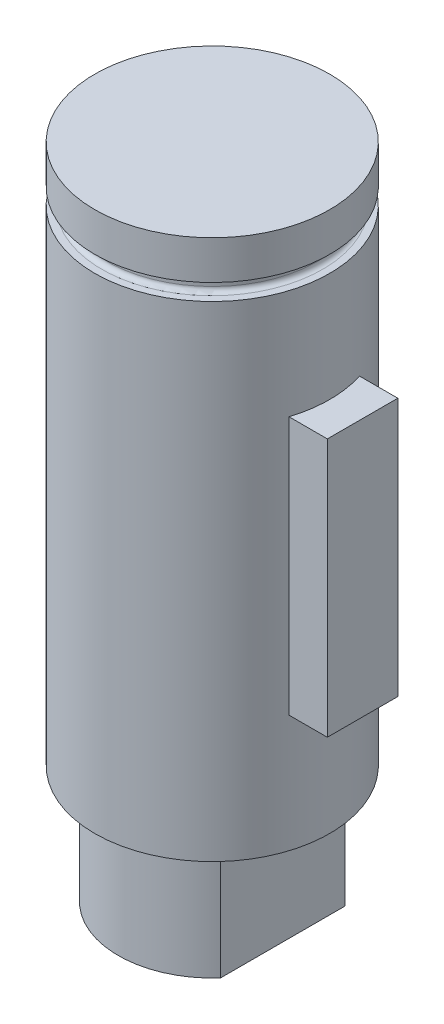
ISO-10303-21;
HEADER;
FILE_DESCRIPTION(('STEP AP214'),'2;1');
FILE_NAME('part.step','',(''),(''),'','','');
FILE_SCHEMA(('AUTOMOTIVE_DESIGN { 1 0 10303 214 1 1 1 1 }'));
ENDSEC;
DATA;
#1=APPLICATION_CONTEXT('core data for automotive mechanical design processes');
#2=APPLICATION_PROTOCOL_DEFINITION('international standard','automotive_design',2000,#1);
#3=PRODUCT_CONTEXT('',#1,'mechanical');
#4=PRODUCT('Part','Part','',(#3));
#5=PRODUCT_RELATED_PRODUCT_CATEGORY('part','',(#4));
#6=PRODUCT_DEFINITION_FORMATION('','',#4);
#7=PRODUCT_DEFINITION_CONTEXT('part definition',#1,'design');
#8=PRODUCT_DEFINITION('design','',#6,#7);
#9=PRODUCT_DEFINITION_SHAPE('','',#8);
#10=(LENGTH_UNIT() NAMED_UNIT(*) SI_UNIT(.MILLI.,.METRE.));
#11=(NAMED_UNIT(*) PLANE_ANGLE_UNIT() SI_UNIT($,.RADIAN.));
#12=(NAMED_UNIT(*) SI_UNIT($,.STERADIAN.) SOLID_ANGLE_UNIT());
#13=UNCERTAINTY_MEASURE_WITH_UNIT(LENGTH_MEASURE(1.E-05),#10,'distance_accuracy_value','');
#14=(GEOMETRIC_REPRESENTATION_CONTEXT(3) GLOBAL_UNCERTAINTY_ASSIGNED_CONTEXT((#13)) GLOBAL_UNIT_ASSIGNED_CONTEXT((#10,
#11,#12)) REPRESENTATION_CONTEXT('',''));
#15=CARTESIAN_POINT('',(0.,0.,0.));
#16=DIRECTION('',(0.,0.,1.));
#17=DIRECTION('',(1.,0.,0.));
#18=AXIS2_PLACEMENT_3D('',#15,#16,#17);
#19=CARTESIAN_POINT('',(0.,11.,0.));
#20=DIRECTION('',(0.,-1.,0.));
#21=DIRECTION('',(0.,0.,-1.));
#22=AXIS2_PLACEMENT_3D('',#19,#20,#21);
#23=CYLINDRICAL_SURFACE('',#22,5.);
#24=CARTESIAN_POINT('',(0.,-5.,0.));
#25=DIRECTION('',(0.,-1.,0.));
#26=DIRECTION('',(0.,0.,-1.));
#27=AXIS2_PLACEMENT_3D('',#24,#25,#26);
#28=CIRCLE('',#27,5.);
#29=CARTESIAN_POINT('',(0.,-5.,-5.));
#30=VERTEX_POINT('',#29);
#31=EDGE_CURVE('E139',#30,#30,#28,.T.);
#32=ORIENTED_EDGE('',*,*,#31,.F.);
#33=EDGE_LOOP('',(#32));
#34=FACE_BOUND('',#33,.T.);
#35=DIRECTION('',(0.,-1.,0.));
#36=VECTOR('',#35,1.);
#37=CARTESIAN_POINT('',(4.76969600708473,11.,-1.5));
#38=LINE('',#37,#36);
#39=CARTESIAN_POINT('',(4.76969600708473,11.,-1.5));
#40=VERTEX_POINT('',#39);
#41=CARTESIAN_POINT('',(4.76969600708473,0.,-1.5));
#42=VERTEX_POINT('',#41);
#43=EDGE_CURVE('E155',#40,#42,#38,.T.);
#44=ORIENTED_EDGE('',*,*,#43,.T.);
#45=CARTESIAN_POINT('',(0.,0.,0.));
#46=DIRECTION('',(0.,-1.,0.));
#47=DIRECTION('',(0.,0.,-1.));
#48=AXIS2_PLACEMENT_3D('',#45,#46,#47);
#49=CIRCLE('',#48,5.);
#50=CARTESIAN_POINT('',(4.76969600708473,0.,1.5));
#51=VERTEX_POINT('',#50);
#52=EDGE_CURVE('E138',#42,#51,#49,.T.);
#53=ORIENTED_EDGE('',*,*,#52,.T.);
#54=DIRECTION('',(0.,-1.,0.));
#55=VECTOR('',#54,1.);
#56=CARTESIAN_POINT('',(4.76969600708473,11.,1.5));
#57=LINE('',#56,#55);
#58=CARTESIAN_POINT('',(4.76969600708473,11.,1.5));
#59=VERTEX_POINT('',#58);
#60=EDGE_CURVE('E11',#59,#51,#57,.T.);
#61=ORIENTED_EDGE('',*,*,#60,.F.);
#62=CARTESIAN_POINT('',(0.,11.,0.));
#63=DIRECTION('',(0.,1.,0.));
#64=DIRECTION('',(0.,0.,1.));
#65=AXIS2_PLACEMENT_3D('',#62,#63,#64);
#66=CIRCLE('',#65,5.);
#67=EDGE_CURVE('E142',#59,#40,#66,.T.);
#68=ORIENTED_EDGE('',*,*,#67,.T.);
#69=EDGE_LOOP('',(#44,#53,#61,#68));
#70=FACE_BOUND('',#69,.T.);
#71=CARTESIAN_POINT('',(0.,15.65,0.));
#72=DIRECTION('',(0.,1.,0.));
#73=DIRECTION('',(0.,0.,1.));
#74=AXIS2_PLACEMENT_3D('',#71,#72,#73);
#75=CIRCLE('',#74,5.);
#76=CARTESIAN_POINT('',(0.,15.65,5.));
#77=VERTEX_POINT('',#76);
#78=EDGE_CURVE('E40',#77,#77,#75,.T.);
#79=ORIENTED_EDGE('',*,*,#78,.F.);
#80=EDGE_LOOP('',(#79));
#81=FACE_BOUND('',#80,.T.);
#82=ADVANCED_FACE('F37',(#34,#70,#81),#23,.T.);
#83=CARTESIAN_POINT('',(0.,0.,0.));
#84=DIRECTION('',(0.,1.,0.));
#85=DIRECTION('',(0.,0.,1.));
#86=AXIS2_PLACEMENT_3D('',#83,#84,#85);
#87=PLANE('',#86);
#88=ORIENTED_EDGE('',*,*,#52,.F.);
#89=DIRECTION('',(-1.,0.,0.));
#90=VECTOR('',#89,1.);
#91=CARTESIAN_POINT('',(6.4,0.,-1.5));
#92=LINE('',#91,#90);
#93=CARTESIAN_POINT('',(6.4,0.,-1.5));
#94=VERTEX_POINT('',#93);
#95=EDGE_CURVE('E152',#94,#42,#92,.T.);
#96=ORIENTED_EDGE('',*,*,#95,.F.);
#97=DIRECTION('',(0.,0.,-1.));
#98=VECTOR('',#97,1.);
#99=CARTESIAN_POINT('',(6.4,0.,1.5));
#100=LINE('',#99,#98);
#101=CARTESIAN_POINT('',(6.4,0.,1.5));
#102=VERTEX_POINT('',#101);
#103=EDGE_CURVE('E79',#102,#94,#100,.T.);
#104=ORIENTED_EDGE('',*,*,#103,.F.);
#105=DIRECTION('',(1.,0.,0.));
#106=VECTOR('',#105,1.);
#107=CARTESIAN_POINT('',(6.4,0.,1.5));
#108=LINE('',#107,#106);
#109=EDGE_CURVE('E147',#51,#102,#108,.T.);
#110=ORIENTED_EDGE('',*,*,#109,.F.);
#111=EDGE_LOOP('',(#88,#96,#104,#110));
#112=FACE_BOUND('',#111,.T.);
#113=ADVANCED_FACE('F173',(#112),#87,.F.);
#114=CARTESIAN_POINT('',(6.4,11.,1.5));
#115=DIRECTION('',(0.,0.,-1.));
#116=DIRECTION('',(-1.,0.,0.));
#117=AXIS2_PLACEMENT_3D('',#114,#115,#116);
#118=PLANE('',#117);
#119=ORIENTED_EDGE('',*,*,#109,.T.);
#120=DIRECTION('',(0.,-1.,0.));
#121=VECTOR('',#120,1.);
#122=CARTESIAN_POINT('',(6.4,11.,1.5));
#123=LINE('',#122,#121);
#124=CARTESIAN_POINT('',(6.4,11.,1.5));
#125=VERTEX_POINT('',#124);
#126=EDGE_CURVE('E45',#125,#102,#123,.T.);
#127=ORIENTED_EDGE('',*,*,#126,.F.);
#128=DIRECTION('',(1.,0.,0.));
#129=VECTOR('',#128,1.);
#130=CARTESIAN_POINT('',(6.4,11.,1.5));
#131=LINE('',#130,#129);
#132=EDGE_CURVE('E83',#59,#125,#131,.T.);
#133=ORIENTED_EDGE('',*,*,#132,.F.);
#134=ORIENTED_EDGE('',*,*,#60,.T.);
#135=EDGE_LOOP('',(#119,#127,#133,#134));
#136=FACE_BOUND('',#135,.T.);
#137=ADVANCED_FACE('F179',(#136),#118,.F.);
#138=CARTESIAN_POINT('',(6.4,11.,1.5));
#139=DIRECTION('',(-1.,0.,0.));
#140=DIRECTION('',(0.,0.,1.));
#141=AXIS2_PLACEMENT_3D('',#138,#139,#140);
#142=PLANE('',#141);
#143=ORIENTED_EDGE('',*,*,#103,.T.);
#144=DIRECTION('',(0.,-1.,0.));
#145=VECTOR('',#144,1.);
#146=CARTESIAN_POINT('',(6.4,11.,-1.5));
#147=LINE('',#146,#145);
#148=CARTESIAN_POINT('',(6.4,11.,-1.5));
#149=VERTEX_POINT('',#148);
#150=EDGE_CURVE('E162',#149,#94,#147,.T.);
#151=ORIENTED_EDGE('',*,*,#150,.F.);
#152=DIRECTION('',(0.,0.,-1.));
#153=VECTOR('',#152,1.);
#154=CARTESIAN_POINT('',(6.4,11.,1.5));
#155=LINE('',#154,#153);
#156=EDGE_CURVE('E151',#125,#149,#155,.T.);
#157=ORIENTED_EDGE('',*,*,#156,.F.);
#158=ORIENTED_EDGE('',*,*,#126,.T.);
#159=EDGE_LOOP('',(#143,#151,#157,#158));
#160=FACE_BOUND('',#159,.T.);
#161=ADVANCED_FACE('F213',(#160),#142,.F.);
#162=CARTESIAN_POINT('',(6.4,11.,-1.5));
#163=DIRECTION('',(0.,0.,1.));
#164=DIRECTION('',(1.,0.,0.));
#165=AXIS2_PLACEMENT_3D('',#162,#163,#164);
#166=PLANE('',#165);
#167=ORIENTED_EDGE('',*,*,#95,.T.);
#168=ORIENTED_EDGE('',*,*,#43,.F.);
#169=DIRECTION('',(-1.,0.,0.));
#170=VECTOR('',#169,1.);
#171=CARTESIAN_POINT('',(6.4,11.,-1.5));
#172=LINE('',#171,#170);
#173=EDGE_CURVE('E61',#149,#40,#172,.T.);
#174=ORIENTED_EDGE('',*,*,#173,.F.);
#175=ORIENTED_EDGE('',*,*,#150,.T.);
#176=EDGE_LOOP('',(#167,#168,#174,#175));
#177=FACE_BOUND('',#176,.T.);
#178=ADVANCED_FACE('F209',(#177),#166,.F.);
#179=CARTESIAN_POINT('',(0.,11.,0.));
#180=DIRECTION('',(0.,1.,0.));
#181=DIRECTION('',(0.,0.,1.));
#182=AXIS2_PLACEMENT_3D('',#179,#180,#181);
#183=PLANE('',#182);
#184=ORIENTED_EDGE('',*,*,#67,.F.);
#185=ORIENTED_EDGE('',*,*,#132,.T.);
#186=ORIENTED_EDGE('',*,*,#156,.T.);
#187=ORIENTED_EDGE('',*,*,#173,.T.);
#188=EDGE_LOOP('',(#184,#185,#186,#187));
#189=FACE_BOUND('',#188,.T.);
#190=ADVANCED_FACE('F207',(#189),#183,.T.);
#191=CARTESIAN_POINT('',(0.,-5.,0.));
#192=DIRECTION('',(0.,-1.,0.));
#193=DIRECTION('',(0.,0.,-1.));
#194=AXIS2_PLACEMENT_3D('',#191,#192,#193);
#195=PLANE('',#194);
#196=CARTESIAN_POINT('',(0.,-5.,0.));
#197=DIRECTION('',(0.,-1.,0.));
#198=DIRECTION('',(0.,0.,-1.));
#199=AXIS2_PLACEMENT_3D('',#196,#197,#198);
#200=CIRCLE('',#199,4.);
#201=CARTESIAN_POINT('',(3.,-5.,2.64575131106459));
#202=VERTEX_POINT('',#201);
#203=CARTESIAN_POINT('',(3.,-5.,-2.64575131106459));
#204=VERTEX_POINT('',#203);
#205=EDGE_CURVE('E117',#202,#204,#200,.T.);
#206=ORIENTED_EDGE('',*,*,#205,.F.);
#207=DIRECTION('',(0.,0.,1.));
#208=VECTOR('',#207,1.);
#209=CARTESIAN_POINT('',(3.,-5.,-2.64575131106459));
#210=LINE('',#209,#208);
#211=EDGE_CURVE('E52',#204,#202,#210,.T.);
#212=ORIENTED_EDGE('',*,*,#211,.F.);
#213=EDGE_LOOP('',(#206,#212));
#214=FACE_BOUND('',#213,.T.);
#215=ORIENTED_EDGE('',*,*,#31,.T.);
#216=EDGE_LOOP('',(#215));
#217=FACE_BOUND('',#216,.T.);
#218=ADVANCED_FACE('F205',(#214,#217),#195,.T.);
#219=CARTESIAN_POINT('',(-5.96393148009187,15.65,-1.15635042299866));
#220=DIRECTION('',(0.,1.,0.));
#221=DIRECTION('',(0.,0.,1.));
#222=AXIS2_PLACEMENT_3D('',#219,#220,#221);
#223=PLANE('',#222);
#224=CARTESIAN_POINT('',(0.,15.65,0.));
#225=DIRECTION('',(0.,-1.,0.));
#226=DIRECTION('',(0.,0.,-1.));
#227=AXIS2_PLACEMENT_3D('',#224,#225,#226);
#228=CIRCLE('',#227,4.7);
#229=CARTESIAN_POINT('',(0.,15.65,-4.7));
#230=VERTEX_POINT('',#229);
#231=EDGE_CURVE('E131',#230,#230,#228,.T.);
#232=ORIENTED_EDGE('',*,*,#231,.T.);
#233=EDGE_LOOP('',(#232));
#234=FACE_BOUND('',#233,.T.);
#235=ORIENTED_EDGE('',*,*,#78,.T.);
#236=EDGE_LOOP('',(#235));
#237=FACE_BOUND('',#236,.T.);
#238=ADVANCED_FACE('F170',(#234,#237),#223,.T.);
#239=CARTESIAN_POINT('',(-4.61407044550317,16.35,-0.894625018616246));
#240=DIRECTION('',(0.,-1.,0.));
#241=DIRECTION('',(0.,0.,-1.));
#242=AXIS2_PLACEMENT_3D('',#239,#240,#241);
#243=PLANE('',#242);
#244=CARTESIAN_POINT('',(0.,16.35,0.));
#245=DIRECTION('',(0.,-1.,0.));
#246=DIRECTION('',(0.,0.,-1.));
#247=AXIS2_PLACEMENT_3D('',#244,#245,#246);
#248=CIRCLE('',#247,4.7);
#249=CARTESIAN_POINT('',(0.,16.35,-4.7));
#250=VERTEX_POINT('',#249);
#251=EDGE_CURVE('E118',#250,#250,#248,.T.);
#252=ORIENTED_EDGE('',*,*,#251,.F.);
#253=EDGE_LOOP('',(#252));
#254=FACE_BOUND('',#253,.T.);
#255=CARTESIAN_POINT('',(0.,16.35,0.));
#256=DIRECTION('',(0.,-1.,0.));
#257=DIRECTION('',(0.,0.,-1.));
#258=AXIS2_PLACEMENT_3D('',#255,#256,#257);
#259=CIRCLE('',#258,5.);
#260=CARTESIAN_POINT('',(0.,16.35,-5.));
#261=VERTEX_POINT('',#260);
#262=EDGE_CURVE('E134',#261,#261,#259,.T.);
#263=ORIENTED_EDGE('',*,*,#262,.T.);
#264=EDGE_LOOP('',(#263));
#265=FACE_BOUND('',#264,.T.);
#266=ADVANCED_FACE('F250',(#254,#265),#243,.T.);
#267=CARTESIAN_POINT('',(0.,15.85,0.));
#268=DIRECTION('',(0.,-1.,0.));
#269=DIRECTION('',(0.,0.,-1.));
#270=AXIS2_PLACEMENT_3D('',#267,#268,#269);
#271=TOROIDAL_SURFACE('',#270,4.7,0.2);
#272=CARTESIAN_POINT('',(0.,15.85,0.));
#273=DIRECTION('',(0.,-1.,0.));
#274=DIRECTION('',(0.,0.,-1.));
#275=AXIS2_PLACEMENT_3D('',#272,#273,#274);
#276=CIRCLE('',#275,4.5);
#277=CARTESIAN_POINT('',(0.,15.85,-4.5));
#278=VERTEX_POINT('',#277);
#279=EDGE_CURVE('E128',#278,#278,#276,.T.);
#280=ORIENTED_EDGE('',*,*,#279,.T.);
#281=EDGE_LOOP('',(#280));
#282=FACE_BOUND('',#281,.T.);
#283=ORIENTED_EDGE('',*,*,#231,.F.);
#284=EDGE_LOOP('',(#283));
#285=FACE_BOUND('',#284,.T.);
#286=ADVANCED_FACE('F259',(#282,#285),#271,.F.);
#287=CARTESIAN_POINT('',(0.,56.4653706665131,0.));
#288=DIRECTION('',(0.,-1.,0.));
#289=DIRECTION('',(0.,0.,-1.));
#290=AXIS2_PLACEMENT_3D('',#287,#288,#289);
#291=CYLINDRICAL_SURFACE('',#290,4.5);
#292=CARTESIAN_POINT('',(0.,16.15,0.));
#293=DIRECTION('',(0.,-1.,0.));
#294=DIRECTION('',(0.,0.,-1.));
#295=AXIS2_PLACEMENT_3D('',#292,#293,#294);
#296=CIRCLE('',#295,4.5);
#297=CARTESIAN_POINT('',(0.,16.15,-4.5));
#298=VERTEX_POINT('',#297);
#299=EDGE_CURVE('E121',#298,#298,#296,.T.);
#300=ORIENTED_EDGE('',*,*,#299,.T.);
#301=EDGE_LOOP('',(#300));
#302=FACE_BOUND('',#301,.T.);
#303=ORIENTED_EDGE('',*,*,#279,.F.);
#304=EDGE_LOOP('',(#303));
#305=FACE_BOUND('',#304,.T.);
#306=ADVANCED_FACE('F200',(#302,#305),#291,.T.);
#307=CARTESIAN_POINT('',(0.,16.15,0.));
#308=DIRECTION('',(0.,-1.,0.));
#309=DIRECTION('',(0.,0.,-1.));
#310=AXIS2_PLACEMENT_3D('',#307,#308,#309);
#311=TOROIDAL_SURFACE('',#310,4.7,0.2);
#312=ORIENTED_EDGE('',*,*,#251,.T.);
#313=EDGE_LOOP('',(#312));
#314=FACE_BOUND('',#313,.T.);
#315=ORIENTED_EDGE('',*,*,#299,.F.);
#316=EDGE_LOOP('',(#315));
#317=FACE_BOUND('',#316,.T.);
#318=ADVANCED_FACE('F192',(#314,#317),#311,.F.);
#319=CARTESIAN_POINT('',(0.,18.,0.));
#320=DIRECTION('',(0.,1.,0.));
#321=DIRECTION('',(0.,0.,1.));
#322=AXIS2_PLACEMENT_3D('',#319,#320,#321);
#323=PLANE('',#322);
#324=CARTESIAN_POINT('',(0.,18.,0.));
#325=DIRECTION('',(0.,1.,0.));
#326=DIRECTION('',(0.,0.,1.));
#327=AXIS2_PLACEMENT_3D('',#324,#325,#326);
#328=CIRCLE('',#327,5.);
#329=CARTESIAN_POINT('',(0.,18.,5.));
#330=VERTEX_POINT('',#329);
#331=EDGE_CURVE('E144',#330,#330,#328,.T.);
#332=ORIENTED_EDGE('',*,*,#331,.T.);
#333=EDGE_LOOP('',(#332));
#334=FACE_BOUND('',#333,.T.);
#335=ADVANCED_FACE('F185',(#334),#323,.T.);
#336=ORIENTED_EDGE('',*,*,#331,.F.);
#337=EDGE_LOOP('',(#336));
#338=FACE_BOUND('',#337,.T.);
#339=ORIENTED_EDGE('',*,*,#262,.F.);
#340=EDGE_LOOP('',(#339));
#341=FACE_BOUND('',#340,.T.);
#342=ADVANCED_FACE('F175',(#338,#341),#23,.T.);
#343=CARTESIAN_POINT('',(0.,-10.,0.));
#344=DIRECTION('',(0.,-1.,0.));
#345=DIRECTION('',(0.,0.,-1.));
#346=AXIS2_PLACEMENT_3D('',#343,#344,#345);
#347=PLANE('',#346);
#348=CARTESIAN_POINT('',(0.,-10.,0.));
#349=DIRECTION('',(0.,-1.,0.));
#350=DIRECTION('',(0.,0.,-1.));
#351=AXIS2_PLACEMENT_3D('',#348,#349,#350);
#352=CIRCLE('',#351,4.);
#353=CARTESIAN_POINT('',(3.,-10.,2.64575131106459));
#354=VERTEX_POINT('',#353);
#355=CARTESIAN_POINT('',(3.,-10.,-2.64575131106459));
#356=VERTEX_POINT('',#355);
#357=EDGE_CURVE('E110',#354,#356,#352,.T.);
#358=ORIENTED_EDGE('',*,*,#357,.T.);
#359=DIRECTION('',(0.,0.,1.));
#360=VECTOR('',#359,1.);
#361=CARTESIAN_POINT('',(3.,-10.,-2.64575131106459));
#362=LINE('',#361,#360);
#363=EDGE_CURVE('E100',#356,#354,#362,.T.);
#364=ORIENTED_EDGE('',*,*,#363,.T.);
#365=EDGE_LOOP('',(#358,#364));
#366=FACE_BOUND('',#365,.T.);
#367=CARTESIAN_POINT('',(0.,-10.,0.));
#368=DIRECTION('',(0.,-1.,0.));
#369=DIRECTION('',(0.,0.,-1.));
#370=AXIS2_PLACEMENT_3D('',#367,#368,#369);
#371=CIRCLE('',#370,1.5);
#372=CARTESIAN_POINT('',(0.,-10.,-1.5));
#373=VERTEX_POINT('',#372);
#374=EDGE_CURVE('E383',#373,#373,#371,.T.);
#375=ORIENTED_EDGE('',*,*,#374,.F.);
#376=EDGE_LOOP('',(#375));
#377=FACE_BOUND('',#376,.T.);
#378=ADVANCED_FACE('F112',(#366,#377),#347,.T.);
#379=CARTESIAN_POINT('',(0.,-10.,0.));
#380=DIRECTION('',(0.,1.,0.));
#381=DIRECTION('',(0.,0.,1.));
#382=AXIS2_PLACEMENT_3D('',#379,#380,#381);
#383=CYLINDRICAL_SURFACE('',#382,4.);
#384=ORIENTED_EDGE('',*,*,#205,.T.);
#385=DIRECTION('',(0.,1.,0.));
#386=VECTOR('',#385,1.);
#387=CARTESIAN_POINT('',(3.,-10.,-2.64575131106459));
#388=LINE('',#387,#386);
#389=EDGE_CURVE('E104',#356,#204,#388,.T.);
#390=ORIENTED_EDGE('',*,*,#389,.F.);
#391=ORIENTED_EDGE('',*,*,#357,.F.);
#392=DIRECTION('',(0.,1.,0.));
#393=VECTOR('',#392,1.);
#394=CARTESIAN_POINT('',(3.,-10.,2.64575131106459));
#395=LINE('',#394,#393);
#396=EDGE_CURVE('E107',#354,#202,#395,.T.);
#397=ORIENTED_EDGE('',*,*,#396,.T.);
#398=EDGE_LOOP('',(#384,#390,#391,#397));
#399=FACE_BOUND('',#398,.T.);
#400=ADVANCED_FACE('F116',(#399),#383,.T.);
#401=CARTESIAN_POINT('',(3.,-10.,-2.64575131106459));
#402=DIRECTION('',(-1.,0.,0.));
#403=DIRECTION('',(0.,0.,1.));
#404=AXIS2_PLACEMENT_3D('',#401,#402,#403);
#405=PLANE('',#404);
#406=ORIENTED_EDGE('',*,*,#211,.T.);
#407=ORIENTED_EDGE('',*,*,#396,.F.);
#408=ORIENTED_EDGE('',*,*,#363,.F.);
#409=ORIENTED_EDGE('',*,*,#389,.T.);
#410=EDGE_LOOP('',(#406,#407,#408,#409));
#411=FACE_BOUND('',#410,.T.);
#412=ADVANCED_FACE('F102',(#411),#405,.F.);
#413=CARTESIAN_POINT('',(0.,0.,0.));
#414=DIRECTION('',(0.,-1.,0.));
#415=DIRECTION('',(0.,0.,-1.));
#416=AXIS2_PLACEMENT_3D('',#413,#414,#415);
#417=PLANE('',#416);
#418=CARTESIAN_POINT('',(0.,0.,0.));
#419=DIRECTION('',(0.,-1.,0.));
#420=DIRECTION('',(0.,0.,-1.));
#421=AXIS2_PLACEMENT_3D('',#418,#419,#420);
#422=CIRCLE('',#421,1.5);
#423=CARTESIAN_POINT('',(0.,0.,-1.5));
#424=VERTEX_POINT('',#423);
#425=EDGE_CURVE('E135',#424,#424,#422,.T.);
#426=ORIENTED_EDGE('',*,*,#425,.T.);
#427=EDGE_LOOP('',(#426));
#428=FACE_BOUND('',#427,.T.);
#429=ADVANCED_FACE('F320',(#428),#417,.T.);
#430=CARTESIAN_POINT('',(0.,0.,0.));
#431=DIRECTION('',(0.,-1.,0.));
#432=DIRECTION('',(0.,0.,-1.));
#433=AXIS2_PLACEMENT_3D('',#430,#431,#432);
#434=CYLINDRICAL_SURFACE('',#433,1.5);
#435=ORIENTED_EDGE('',*,*,#425,.F.);
#436=EDGE_LOOP('',(#435));
#437=FACE_BOUND('',#436,.T.);
#438=ORIENTED_EDGE('',*,*,#374,.T.);
#439=EDGE_LOOP('',(#438));
#440=FACE_BOUND('',#439,.T.);
#441=ADVANCED_FACE('F324',(#437,#440),#434,.F.);
#442=CLOSED_SHELL('',(#82,#113,#137,#161,#178,#190,#218,#238,#266,#286,#306,#318,#335,#342,#378,
#400,#412,#429,#441));
#443=MANIFOLD_SOLID_BREP('B2',#442);
#444=ADVANCED_BREP_SHAPE_REPRESENTATION('',(#18,#443),#14);
#445=SHAPE_DEFINITION_REPRESENTATION(#9,#444);
ENDSEC;
END-ISO-10303-21;
